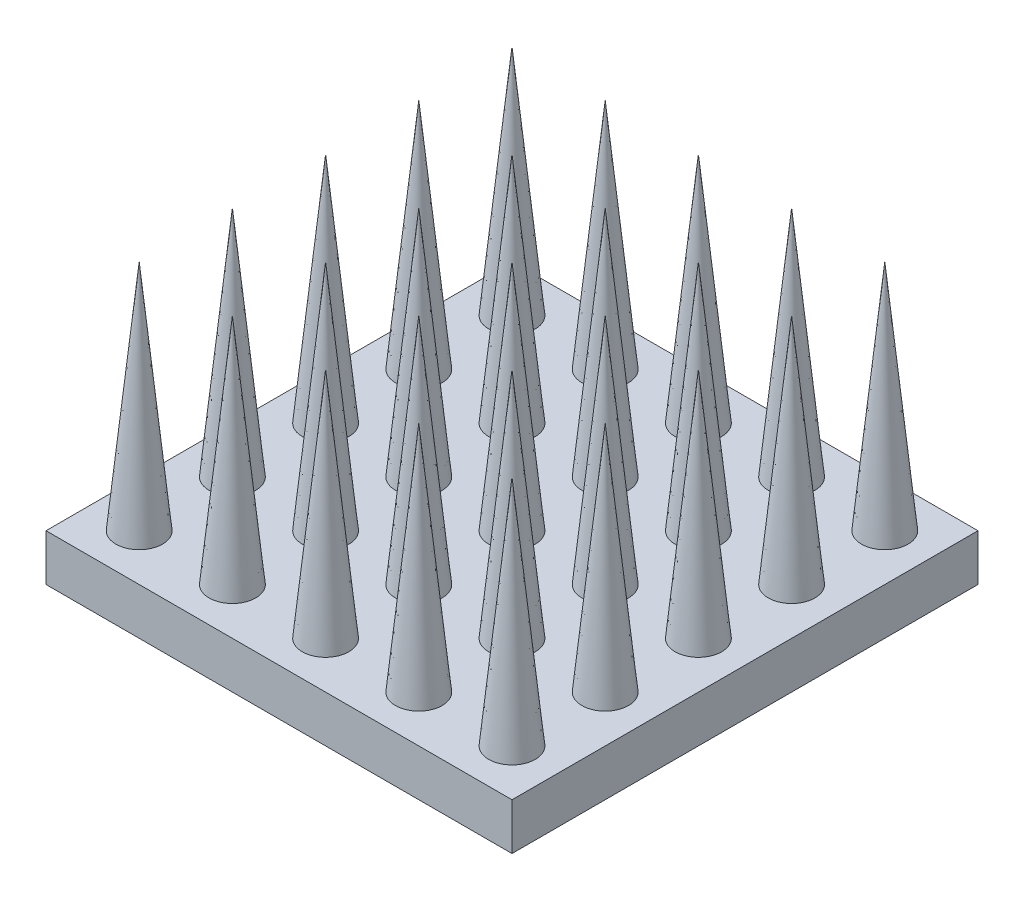
ISO-10303-21;
HEADER;
FILE_DESCRIPTION(('STEP AP214'),'2;1');
FILE_NAME('part.step','',(''),(''),'','','');
FILE_SCHEMA(('AUTOMOTIVE_DESIGN { 1 0 10303 214 1 1 1 1 }'));
ENDSEC;
DATA;
#1=APPLICATION_CONTEXT('core data for automotive mechanical design processes');
#2=APPLICATION_PROTOCOL_DEFINITION('international standard','automotive_design',2000,#1);
#3=PRODUCT_CONTEXT('',#1,'mechanical');
#4=PRODUCT('Part','Part','',(#3));
#5=PRODUCT_RELATED_PRODUCT_CATEGORY('part','',(#4));
#6=PRODUCT_DEFINITION_FORMATION('','',#4);
#7=PRODUCT_DEFINITION_CONTEXT('part definition',#1,'design');
#8=PRODUCT_DEFINITION('design','',#6,#7);
#9=PRODUCT_DEFINITION_SHAPE('','',#8);
#10=(LENGTH_UNIT() NAMED_UNIT(*) SI_UNIT(.MILLI.,.METRE.));
#11=(NAMED_UNIT(*) PLANE_ANGLE_UNIT() SI_UNIT($,.RADIAN.));
#12=(NAMED_UNIT(*) SI_UNIT($,.STERADIAN.) SOLID_ANGLE_UNIT());
#13=UNCERTAINTY_MEASURE_WITH_UNIT(LENGTH_MEASURE(1.E-05),#10,'distance_accuracy_value','');
#14=(GEOMETRIC_REPRESENTATION_CONTEXT(3) GLOBAL_UNCERTAINTY_ASSIGNED_CONTEXT((#13)) GLOBAL_UNIT_ASSIGNED_CONTEXT((#10,
#11,#12)) REPRESENTATION_CONTEXT('',''));
#15=CARTESIAN_POINT('',(0.,0.,0.));
#16=DIRECTION('',(0.,0.,1.));
#17=DIRECTION('',(1.,0.,0.));
#18=AXIS2_PLACEMENT_3D('',#15,#16,#17);
#19=CARTESIAN_POINT('',(-4.5,1.,-4.));
#20=DIRECTION('',(0.,-1.,0.));
#21=DIRECTION('',(1.,0.,0.));
#22=AXIS2_PLACEMENT_3D('',#19,#20,#21);
#23=PLANE('',#22);
#24=CARTESIAN_POINT('',(-4.,1.,-4.));
#25=DIRECTION('',(0.,-1.,0.));
#26=DIRECTION('',(1.,0.,0.));
#27=AXIS2_PLACEMENT_3D('',#24,#25,#26);
#28=CIRCLE('',#27,0.500000000000001);
#29=CARTESIAN_POINT('',(-3.5,1.,-4.));
#30=VERTEX_POINT('',#29);
#31=EDGE_CURVE('E12',#30,#30,#28,.T.);
#32=ORIENTED_EDGE('',*,*,#31,.T.);
#33=EDGE_LOOP('',(#32));
#34=FACE_BOUND('',#33,.T.);
#35=ADVANCED_FACE('F44',(#34),#23,.T.);
#36=CARTESIAN_POINT('',(-4.,1.,-4.));
#37=DIRECTION('',(0.,-1.,0.));
#38=DIRECTION('',(1.,0.,0.));
#39=AXIS2_PLACEMENT_3D('',#36,#37,#38);
#40=CONICAL_SURFACE('',#39,0.500000000000001,0.0996686524911622);
#41=CARTESIAN_POINT('',(-4.,6.,-4.));
#42=VERTEX_POINT('',#41);
#43=VERTEX_LOOP('',#42);
#44=FACE_BOUND('',#43,.T.);
#45=ORIENTED_EDGE('',*,*,#31,.F.);
#46=EDGE_LOOP('',(#45));
#47=FACE_BOUND('',#46,.T.);
#48=ADVANCED_FACE('F51',(#44,#47),#40,.T.);
#49=CLOSED_SHELL('',(#35,#48));
#50=MANIFOLD_SOLID_BREP('B2',#49);
#51=CARTESIAN_POINT('',(-2.5,1.,-4.));
#52=DIRECTION('',(0.,-1.,0.));
#53=DIRECTION('',(1.,0.,0.));
#54=AXIS2_PLACEMENT_3D('',#51,#52,#53);
#55=PLANE('',#54);
#56=CARTESIAN_POINT('',(-2.,1.,-4.));
#57=DIRECTION('',(0.,-1.,0.));
#58=DIRECTION('',(1.,0.,0.));
#59=AXIS2_PLACEMENT_3D('',#56,#57,#58);
#60=CIRCLE('',#59,0.500000000000001);
#61=CARTESIAN_POINT('',(-1.5,1.,-4.));
#62=VERTEX_POINT('',#61);
#63=EDGE_CURVE('E42',#62,#62,#60,.T.);
#64=ORIENTED_EDGE('',*,*,#63,.T.);
#65=EDGE_LOOP('',(#64));
#66=FACE_BOUND('',#65,.T.);
#67=ADVANCED_FACE('F82',(#66),#55,.T.);
#68=CARTESIAN_POINT('',(-2.,1.,-4.));
#69=DIRECTION('',(0.,-1.,0.));
#70=DIRECTION('',(1.,0.,0.));
#71=AXIS2_PLACEMENT_3D('',#68,#69,#70);
#72=CONICAL_SURFACE('',#71,0.500000000000001,0.0996686524911622);
#73=CARTESIAN_POINT('',(-2.,6.,-4.));
#74=VERTEX_POINT('',#73);
#75=VERTEX_LOOP('',#74);
#76=FACE_BOUND('',#75,.T.);
#77=ORIENTED_EDGE('',*,*,#63,.F.);
#78=EDGE_LOOP('',(#77));
#79=FACE_BOUND('',#78,.T.);
#80=ADVANCED_FACE('F89',(#76,#79),#72,.T.);
#81=CLOSED_SHELL('',(#67,#80));
#82=MANIFOLD_SOLID_BREP('B6',#81);
#83=CARTESIAN_POINT('',(-0.500000000000002,1.,-4.));
#84=DIRECTION('',(0.,-1.,0.));
#85=DIRECTION('',(1.,0.,0.));
#86=AXIS2_PLACEMENT_3D('',#83,#84,#85);
#87=PLANE('',#86);
#88=CARTESIAN_POINT('',(0.,1.,-4.));
#89=DIRECTION('',(0.,-1.,0.));
#90=DIRECTION('',(1.,0.,0.));
#91=AXIS2_PLACEMENT_3D('',#88,#89,#90);
#92=CIRCLE('',#91,0.500000000000001);
#93=CARTESIAN_POINT('',(0.5,1.,-4.));
#94=VERTEX_POINT('',#93);
#95=EDGE_CURVE('E80',#94,#94,#92,.T.);
#96=ORIENTED_EDGE('',*,*,#95,.T.);
#97=EDGE_LOOP('',(#96));
#98=FACE_BOUND('',#97,.T.);
#99=ADVANCED_FACE('F120',(#98),#87,.T.);
#100=CARTESIAN_POINT('',(0.,1.,-4.));
#101=DIRECTION('',(0.,-1.,0.));
#102=DIRECTION('',(1.,0.,0.));
#103=AXIS2_PLACEMENT_3D('',#100,#101,#102);
#104=CONICAL_SURFACE('',#103,0.500000000000001,0.0996686524911622);
#105=CARTESIAN_POINT('',(0.,6.,-4.));
#106=VERTEX_POINT('',#105);
#107=VERTEX_LOOP('',#106);
#108=FACE_BOUND('',#107,.T.);
#109=ORIENTED_EDGE('',*,*,#95,.F.);
#110=EDGE_LOOP('',(#109));
#111=FACE_BOUND('',#110,.T.);
#112=ADVANCED_FACE('F127',(#108,#111),#104,.T.);
#113=CLOSED_SHELL('',(#99,#112));
#114=MANIFOLD_SOLID_BREP('B36',#113);
#115=CARTESIAN_POINT('',(1.5,1.,-4.));
#116=DIRECTION('',(0.,-1.,0.));
#117=DIRECTION('',(1.,0.,0.));
#118=AXIS2_PLACEMENT_3D('',#115,#116,#117);
#119=PLANE('',#118);
#120=CARTESIAN_POINT('',(2.,1.,-4.));
#121=DIRECTION('',(0.,-1.,0.));
#122=DIRECTION('',(1.,0.,0.));
#123=AXIS2_PLACEMENT_3D('',#120,#121,#122);
#124=CIRCLE('',#123,0.500000000000001);
#125=CARTESIAN_POINT('',(2.5,1.,-4.));
#126=VERTEX_POINT('',#125);
#127=EDGE_CURVE('E118',#126,#126,#124,.T.);
#128=ORIENTED_EDGE('',*,*,#127,.T.);
#129=EDGE_LOOP('',(#128));
#130=FACE_BOUND('',#129,.T.);
#131=ADVANCED_FACE('F158',(#130),#119,.T.);
#132=CARTESIAN_POINT('',(2.,1.,-4.));
#133=DIRECTION('',(0.,-1.,0.));
#134=DIRECTION('',(1.,0.,0.));
#135=AXIS2_PLACEMENT_3D('',#132,#133,#134);
#136=CONICAL_SURFACE('',#135,0.500000000000001,0.0996686524911622);
#137=CARTESIAN_POINT('',(2.,6.,-4.));
#138=VERTEX_POINT('',#137);
#139=VERTEX_LOOP('',#138);
#140=FACE_BOUND('',#139,.T.);
#141=ORIENTED_EDGE('',*,*,#127,.F.);
#142=EDGE_LOOP('',(#141));
#143=FACE_BOUND('',#142,.T.);
#144=ADVANCED_FACE('F165',(#140,#143),#136,.T.);
#145=CLOSED_SHELL('',(#131,#144));
#146=MANIFOLD_SOLID_BREP('B74',#145);
#147=CARTESIAN_POINT('',(-4.5,1.,-2.));
#148=DIRECTION('',(0.,-1.,0.));
#149=DIRECTION('',(1.,0.,0.));
#150=AXIS2_PLACEMENT_3D('',#147,#148,#149);
#151=PLANE('',#150);
#152=CARTESIAN_POINT('',(-4.,1.,-2.));
#153=DIRECTION('',(0.,-1.,0.));
#154=DIRECTION('',(1.,0.,0.));
#155=AXIS2_PLACEMENT_3D('',#152,#153,#154);
#156=CIRCLE('',#155,0.500000000000001);
#157=CARTESIAN_POINT('',(-3.5,1.,-2.));
#158=VERTEX_POINT('',#157);
#159=EDGE_CURVE('E156',#158,#158,#156,.T.);
#160=ORIENTED_EDGE('',*,*,#159,.T.);
#161=EDGE_LOOP('',(#160));
#162=FACE_BOUND('',#161,.T.);
#163=ADVANCED_FACE('F196',(#162),#151,.T.);
#164=CARTESIAN_POINT('',(-4.,1.,-2.));
#165=DIRECTION('',(0.,-1.,0.));
#166=DIRECTION('',(1.,0.,0.));
#167=AXIS2_PLACEMENT_3D('',#164,#165,#166);
#168=CONICAL_SURFACE('',#167,0.500000000000001,0.0996686524911622);
#169=CARTESIAN_POINT('',(-4.,6.,-2.));
#170=VERTEX_POINT('',#169);
#171=VERTEX_LOOP('',#170);
#172=FACE_BOUND('',#171,.T.);
#173=ORIENTED_EDGE('',*,*,#159,.F.);
#174=EDGE_LOOP('',(#173));
#175=FACE_BOUND('',#174,.T.);
#176=ADVANCED_FACE('F203',(#172,#175),#168,.T.);
#177=CLOSED_SHELL('',(#163,#176));
#178=MANIFOLD_SOLID_BREP('B112',#177);
#179=CARTESIAN_POINT('',(-2.5,1.,-2.));
#180=DIRECTION('',(0.,-1.,0.));
#181=DIRECTION('',(1.,0.,0.));
#182=AXIS2_PLACEMENT_3D('',#179,#180,#181);
#183=PLANE('',#182);
#184=CARTESIAN_POINT('',(-2.,1.,-2.));
#185=DIRECTION('',(0.,-1.,0.));
#186=DIRECTION('',(1.,0.,0.));
#187=AXIS2_PLACEMENT_3D('',#184,#185,#186);
#188=CIRCLE('',#187,0.500000000000001);
#189=CARTESIAN_POINT('',(-1.5,1.,-2.));
#190=VERTEX_POINT('',#189);
#191=EDGE_CURVE('E194',#190,#190,#188,.T.);
#192=ORIENTED_EDGE('',*,*,#191,.T.);
#193=EDGE_LOOP('',(#192));
#194=FACE_BOUND('',#193,.T.);
#195=ADVANCED_FACE('F234',(#194),#183,.T.);
#196=CARTESIAN_POINT('',(-2.,1.,-2.));
#197=DIRECTION('',(0.,-1.,0.));
#198=DIRECTION('',(1.,0.,0.));
#199=AXIS2_PLACEMENT_3D('',#196,#197,#198);
#200=CONICAL_SURFACE('',#199,0.500000000000001,0.0996686524911622);
#201=CARTESIAN_POINT('',(-2.,6.,-2.));
#202=VERTEX_POINT('',#201);
#203=VERTEX_LOOP('',#202);
#204=FACE_BOUND('',#203,.T.);
#205=ORIENTED_EDGE('',*,*,#191,.F.);
#206=EDGE_LOOP('',(#205));
#207=FACE_BOUND('',#206,.T.);
#208=ADVANCED_FACE('F241',(#204,#207),#200,.T.);
#209=CLOSED_SHELL('',(#195,#208));
#210=MANIFOLD_SOLID_BREP('B150',#209);
#211=CARTESIAN_POINT('',(-0.500000000000001,1.,-2.));
#212=DIRECTION('',(0.,-1.,0.));
#213=DIRECTION('',(1.,0.,0.));
#214=AXIS2_PLACEMENT_3D('',#211,#212,#213);
#215=PLANE('',#214);
#216=CARTESIAN_POINT('',(0.,1.,-2.));
#217=DIRECTION('',(0.,-1.,0.));
#218=DIRECTION('',(1.,0.,0.));
#219=AXIS2_PLACEMENT_3D('',#216,#217,#218);
#220=CIRCLE('',#219,0.500000000000001);
#221=CARTESIAN_POINT('',(0.5,1.,-2.));
#222=VERTEX_POINT('',#221);
#223=EDGE_CURVE('E232',#222,#222,#220,.T.);
#224=ORIENTED_EDGE('',*,*,#223,.T.);
#225=EDGE_LOOP('',(#224));
#226=FACE_BOUND('',#225,.T.);
#227=ADVANCED_FACE('F272',(#226),#215,.T.);
#228=CARTESIAN_POINT('',(0.,1.,-2.));
#229=DIRECTION('',(0.,-1.,0.));
#230=DIRECTION('',(1.,0.,0.));
#231=AXIS2_PLACEMENT_3D('',#228,#229,#230);
#232=CONICAL_SURFACE('',#231,0.500000000000001,0.0996686524911622);
#233=CARTESIAN_POINT('',(0.,6.,-2.));
#234=VERTEX_POINT('',#233);
#235=VERTEX_LOOP('',#234);
#236=FACE_BOUND('',#235,.T.);
#237=ORIENTED_EDGE('',*,*,#223,.F.);
#238=EDGE_LOOP('',(#237));
#239=FACE_BOUND('',#238,.T.);
#240=ADVANCED_FACE('F279',(#236,#239),#232,.T.);
#241=CLOSED_SHELL('',(#227,#240));
#242=MANIFOLD_SOLID_BREP('B188',#241);
#243=CARTESIAN_POINT('',(1.5,1.,-2.));
#244=DIRECTION('',(0.,-1.,0.));
#245=DIRECTION('',(1.,0.,0.));
#246=AXIS2_PLACEMENT_3D('',#243,#244,#245);
#247=PLANE('',#246);
#248=CARTESIAN_POINT('',(2.,1.,-2.));
#249=DIRECTION('',(0.,-1.,0.));
#250=DIRECTION('',(1.,0.,0.));
#251=AXIS2_PLACEMENT_3D('',#248,#249,#250);
#252=CIRCLE('',#251,0.500000000000001);
#253=CARTESIAN_POINT('',(2.5,1.,-2.));
#254=VERTEX_POINT('',#253);
#255=EDGE_CURVE('E270',#254,#254,#252,.T.);
#256=ORIENTED_EDGE('',*,*,#255,.T.);
#257=EDGE_LOOP('',(#256));
#258=FACE_BOUND('',#257,.T.);
#259=ADVANCED_FACE('F310',(#258),#247,.T.);
#260=CARTESIAN_POINT('',(2.,1.,-2.));
#261=DIRECTION('',(0.,-1.,0.));
#262=DIRECTION('',(1.,0.,0.));
#263=AXIS2_PLACEMENT_3D('',#260,#261,#262);
#264=CONICAL_SURFACE('',#263,0.500000000000001,0.0996686524911622);
#265=CARTESIAN_POINT('',(2.,6.,-2.));
#266=VERTEX_POINT('',#265);
#267=VERTEX_LOOP('',#266);
#268=FACE_BOUND('',#267,.T.);
#269=ORIENTED_EDGE('',*,*,#255,.F.);
#270=EDGE_LOOP('',(#269));
#271=FACE_BOUND('',#270,.T.);
#272=ADVANCED_FACE('F317',(#268,#271),#264,.T.);
#273=CLOSED_SHELL('',(#259,#272));
#274=MANIFOLD_SOLID_BREP('B226',#273);
#275=CARTESIAN_POINT('',(-4.5,1.,0.));
#276=DIRECTION('',(0.,-1.,0.));
#277=DIRECTION('',(1.,0.,0.));
#278=AXIS2_PLACEMENT_3D('',#275,#276,#277);
#279=PLANE('',#278);
#280=CARTESIAN_POINT('',(-4.,1.,0.));
#281=DIRECTION('',(0.,-1.,0.));
#282=DIRECTION('',(1.,0.,0.));
#283=AXIS2_PLACEMENT_3D('',#280,#281,#282);
#284=CIRCLE('',#283,0.500000000000001);
#285=CARTESIAN_POINT('',(-3.5,1.,0.));
#286=VERTEX_POINT('',#285);
#287=EDGE_CURVE('E308',#286,#286,#284,.T.);
#288=ORIENTED_EDGE('',*,*,#287,.T.);
#289=EDGE_LOOP('',(#288));
#290=FACE_BOUND('',#289,.T.);
#291=ADVANCED_FACE('F348',(#290),#279,.T.);
#292=CARTESIAN_POINT('',(-4.,1.,0.));
#293=DIRECTION('',(0.,-1.,0.));
#294=DIRECTION('',(1.,0.,0.));
#295=AXIS2_PLACEMENT_3D('',#292,#293,#294);
#296=CONICAL_SURFACE('',#295,0.500000000000001,0.0996686524911622);
#297=CARTESIAN_POINT('',(-4.,6.,0.));
#298=VERTEX_POINT('',#297);
#299=VERTEX_LOOP('',#298);
#300=FACE_BOUND('',#299,.T.);
#301=ORIENTED_EDGE('',*,*,#287,.F.);
#302=EDGE_LOOP('',(#301));
#303=FACE_BOUND('',#302,.T.);
#304=ADVANCED_FACE('F355',(#300,#303),#296,.T.);
#305=CLOSED_SHELL('',(#291,#304));
#306=MANIFOLD_SOLID_BREP('B264',#305);
#307=CARTESIAN_POINT('',(-2.5,1.,0.));
#308=DIRECTION('',(0.,-1.,0.));
#309=DIRECTION('',(1.,0.,0.));
#310=AXIS2_PLACEMENT_3D('',#307,#308,#309);
#311=PLANE('',#310);
#312=CARTESIAN_POINT('',(-2.,1.,0.));
#313=DIRECTION('',(0.,-1.,0.));
#314=DIRECTION('',(1.,0.,0.));
#315=AXIS2_PLACEMENT_3D('',#312,#313,#314);
#316=CIRCLE('',#315,0.500000000000001);
#317=CARTESIAN_POINT('',(-1.5,1.,0.));
#318=VERTEX_POINT('',#317);
#319=EDGE_CURVE('E346',#318,#318,#316,.T.);
#320=ORIENTED_EDGE('',*,*,#319,.T.);
#321=EDGE_LOOP('',(#320));
#322=FACE_BOUND('',#321,.T.);
#323=ADVANCED_FACE('F386',(#322),#311,.T.);
#324=CARTESIAN_POINT('',(-2.,1.,0.));
#325=DIRECTION('',(0.,-1.,0.));
#326=DIRECTION('',(1.,0.,0.));
#327=AXIS2_PLACEMENT_3D('',#324,#325,#326);
#328=CONICAL_SURFACE('',#327,0.500000000000001,0.0996686524911622);
#329=CARTESIAN_POINT('',(-2.,6.,0.));
#330=VERTEX_POINT('',#329);
#331=VERTEX_LOOP('',#330);
#332=FACE_BOUND('',#331,.T.);
#333=ORIENTED_EDGE('',*,*,#319,.F.);
#334=EDGE_LOOP('',(#333));
#335=FACE_BOUND('',#334,.T.);
#336=ADVANCED_FACE('F393',(#332,#335),#328,.T.);
#337=CLOSED_SHELL('',(#323,#336));
#338=MANIFOLD_SOLID_BREP('B302',#337);
#339=CARTESIAN_POINT('',(-0.500000000000001,1.,0.));
#340=DIRECTION('',(0.,-1.,0.));
#341=DIRECTION('',(1.,0.,0.));
#342=AXIS2_PLACEMENT_3D('',#339,#340,#341);
#343=PLANE('',#342);
#344=CARTESIAN_POINT('',(0.,1.,0.));
#345=DIRECTION('',(0.,-1.,0.));
#346=DIRECTION('',(1.,0.,0.));
#347=AXIS2_PLACEMENT_3D('',#344,#345,#346);
#348=CIRCLE('',#347,0.500000000000001);
#349=CARTESIAN_POINT('',(0.500000000000001,1.,0.));
#350=VERTEX_POINT('',#349);
#351=EDGE_CURVE('E384',#350,#350,#348,.T.);
#352=ORIENTED_EDGE('',*,*,#351,.T.);
#353=EDGE_LOOP('',(#352));
#354=FACE_BOUND('',#353,.T.);
#355=ADVANCED_FACE('F424',(#354),#343,.T.);
#356=CARTESIAN_POINT('',(0.,1.,0.));
#357=DIRECTION('',(0.,-1.,0.));
#358=DIRECTION('',(1.,0.,0.));
#359=AXIS2_PLACEMENT_3D('',#356,#357,#358);
#360=CONICAL_SURFACE('',#359,0.500000000000001,0.0996686524911622);
#361=CARTESIAN_POINT('',(0.,6.,0.));
#362=VERTEX_POINT('',#361);
#363=VERTEX_LOOP('',#362);
#364=FACE_BOUND('',#363,.T.);
#365=ORIENTED_EDGE('',*,*,#351,.F.);
#366=EDGE_LOOP('',(#365));
#367=FACE_BOUND('',#366,.T.);
#368=ADVANCED_FACE('F431',(#364,#367),#360,.T.);
#369=CLOSED_SHELL('',(#355,#368));
#370=MANIFOLD_SOLID_BREP('B340',#369);
#371=CARTESIAN_POINT('',(1.5,1.,0.));
#372=DIRECTION('',(0.,-1.,0.));
#373=DIRECTION('',(1.,0.,0.));
#374=AXIS2_PLACEMENT_3D('',#371,#372,#373);
#375=PLANE('',#374);
#376=CARTESIAN_POINT('',(2.,1.,0.));
#377=DIRECTION('',(0.,-1.,0.));
#378=DIRECTION('',(1.,0.,0.));
#379=AXIS2_PLACEMENT_3D('',#376,#377,#378);
#380=CIRCLE('',#379,0.500000000000001);
#381=CARTESIAN_POINT('',(2.5,1.,0.));
#382=VERTEX_POINT('',#381);
#383=EDGE_CURVE('E422',#382,#382,#380,.T.);
#384=ORIENTED_EDGE('',*,*,#383,.T.);
#385=EDGE_LOOP('',(#384));
#386=FACE_BOUND('',#385,.T.);
#387=ADVANCED_FACE('F462',(#386),#375,.T.);
#388=CARTESIAN_POINT('',(2.,1.,0.));
#389=DIRECTION('',(0.,-1.,0.));
#390=DIRECTION('',(1.,0.,0.));
#391=AXIS2_PLACEMENT_3D('',#388,#389,#390);
#392=CONICAL_SURFACE('',#391,0.500000000000001,0.0996686524911622);
#393=CARTESIAN_POINT('',(2.,6.,0.));
#394=VERTEX_POINT('',#393);
#395=VERTEX_LOOP('',#394);
#396=FACE_BOUND('',#395,.T.);
#397=ORIENTED_EDGE('',*,*,#383,.F.);
#398=EDGE_LOOP('',(#397));
#399=FACE_BOUND('',#398,.T.);
#400=ADVANCED_FACE('F469',(#396,#399),#392,.T.);
#401=CLOSED_SHELL('',(#387,#400));
#402=MANIFOLD_SOLID_BREP('B378',#401);
#403=CARTESIAN_POINT('',(-4.5,1.,2.));
#404=DIRECTION('',(0.,-1.,0.));
#405=DIRECTION('',(1.,0.,0.));
#406=AXIS2_PLACEMENT_3D('',#403,#404,#405);
#407=PLANE('',#406);
#408=CARTESIAN_POINT('',(-4.,1.,2.));
#409=DIRECTION('',(0.,-1.,0.));
#410=DIRECTION('',(1.,0.,0.));
#411=AXIS2_PLACEMENT_3D('',#408,#409,#410);
#412=CIRCLE('',#411,0.500000000000001);
#413=CARTESIAN_POINT('',(-3.5,1.,2.));
#414=VERTEX_POINT('',#413);
#415=EDGE_CURVE('E460',#414,#414,#412,.T.);
#416=ORIENTED_EDGE('',*,*,#415,.T.);
#417=EDGE_LOOP('',(#416));
#418=FACE_BOUND('',#417,.T.);
#419=ADVANCED_FACE('F500',(#418),#407,.T.);
#420=CARTESIAN_POINT('',(-4.,1.,2.));
#421=DIRECTION('',(0.,-1.,0.));
#422=DIRECTION('',(1.,0.,0.));
#423=AXIS2_PLACEMENT_3D('',#420,#421,#422);
#424=CONICAL_SURFACE('',#423,0.500000000000001,0.0996686524911622);
#425=CARTESIAN_POINT('',(-4.,6.,2.));
#426=VERTEX_POINT('',#425);
#427=VERTEX_LOOP('',#426);
#428=FACE_BOUND('',#427,.T.);
#429=ORIENTED_EDGE('',*,*,#415,.F.);
#430=EDGE_LOOP('',(#429));
#431=FACE_BOUND('',#430,.T.);
#432=ADVANCED_FACE('F507',(#428,#431),#424,.T.);
#433=CLOSED_SHELL('',(#419,#432));
#434=MANIFOLD_SOLID_BREP('B416',#433);
#435=CARTESIAN_POINT('',(-2.5,1.,2.));
#436=DIRECTION('',(0.,-1.,0.));
#437=DIRECTION('',(1.,0.,0.));
#438=AXIS2_PLACEMENT_3D('',#435,#436,#437);
#439=PLANE('',#438);
#440=CARTESIAN_POINT('',(-2.,1.,2.));
#441=DIRECTION('',(0.,-1.,0.));
#442=DIRECTION('',(1.,0.,0.));
#443=AXIS2_PLACEMENT_3D('',#440,#441,#442);
#444=CIRCLE('',#443,0.500000000000001);
#445=CARTESIAN_POINT('',(-1.5,1.,2.));
#446=VERTEX_POINT('',#445);
#447=EDGE_CURVE('E498',#446,#446,#444,.T.);
#448=ORIENTED_EDGE('',*,*,#447,.T.);
#449=EDGE_LOOP('',(#448));
#450=FACE_BOUND('',#449,.T.);
#451=ADVANCED_FACE('F538',(#450),#439,.T.);
#452=CARTESIAN_POINT('',(-2.,1.,2.));
#453=DIRECTION('',(0.,-1.,0.));
#454=DIRECTION('',(1.,0.,0.));
#455=AXIS2_PLACEMENT_3D('',#452,#453,#454);
#456=CONICAL_SURFACE('',#455,0.500000000000001,0.0996686524911622);
#457=CARTESIAN_POINT('',(-2.,6.,2.));
#458=VERTEX_POINT('',#457);
#459=VERTEX_LOOP('',#458);
#460=FACE_BOUND('',#459,.T.);
#461=ORIENTED_EDGE('',*,*,#447,.F.);
#462=EDGE_LOOP('',(#461));
#463=FACE_BOUND('',#462,.T.);
#464=ADVANCED_FACE('F545',(#460,#463),#456,.T.);
#465=CLOSED_SHELL('',(#451,#464));
#466=MANIFOLD_SOLID_BREP('B454',#465);
#467=CARTESIAN_POINT('',(-0.500000000000001,1.,2.));
#468=DIRECTION('',(0.,-1.,0.));
#469=DIRECTION('',(1.,0.,0.));
#470=AXIS2_PLACEMENT_3D('',#467,#468,#469);
#471=PLANE('',#470);
#472=CARTESIAN_POINT('',(0.,1.,2.));
#473=DIRECTION('',(0.,-1.,0.));
#474=DIRECTION('',(1.,0.,0.));
#475=AXIS2_PLACEMENT_3D('',#472,#473,#474);
#476=CIRCLE('',#475,0.500000000000001);
#477=CARTESIAN_POINT('',(0.500000000000001,1.,2.));
#478=VERTEX_POINT('',#477);
#479=EDGE_CURVE('E536',#478,#478,#476,.T.);
#480=ORIENTED_EDGE('',*,*,#479,.T.);
#481=EDGE_LOOP('',(#480));
#482=FACE_BOUND('',#481,.T.);
#483=ADVANCED_FACE('F576',(#482),#471,.T.);
#484=CARTESIAN_POINT('',(0.,1.,2.));
#485=DIRECTION('',(0.,-1.,0.));
#486=DIRECTION('',(1.,0.,0.));
#487=AXIS2_PLACEMENT_3D('',#484,#485,#486);
#488=CONICAL_SURFACE('',#487,0.500000000000001,0.0996686524911622);
#489=CARTESIAN_POINT('',(0.,6.,2.));
#490=VERTEX_POINT('',#489);
#491=VERTEX_LOOP('',#490);
#492=FACE_BOUND('',#491,.T.);
#493=ORIENTED_EDGE('',*,*,#479,.F.);
#494=EDGE_LOOP('',(#493));
#495=FACE_BOUND('',#494,.T.);
#496=ADVANCED_FACE('F583',(#492,#495),#488,.T.);
#497=CLOSED_SHELL('',(#483,#496));
#498=MANIFOLD_SOLID_BREP('B492',#497);
#499=CARTESIAN_POINT('',(1.5,1.,2.));
#500=DIRECTION('',(0.,-1.,0.));
#501=DIRECTION('',(1.,0.,0.));
#502=AXIS2_PLACEMENT_3D('',#499,#500,#501);
#503=PLANE('',#502);
#504=CARTESIAN_POINT('',(2.,1.,2.));
#505=DIRECTION('',(0.,-1.,0.));
#506=DIRECTION('',(1.,0.,0.));
#507=AXIS2_PLACEMENT_3D('',#504,#505,#506);
#508=CIRCLE('',#507,0.500000000000001);
#509=CARTESIAN_POINT('',(2.5,1.,2.));
#510=VERTEX_POINT('',#509);
#511=EDGE_CURVE('E574',#510,#510,#508,.T.);
#512=ORIENTED_EDGE('',*,*,#511,.T.);
#513=EDGE_LOOP('',(#512));
#514=FACE_BOUND('',#513,.T.);
#515=ADVANCED_FACE('F614',(#514),#503,.T.);
#516=CARTESIAN_POINT('',(2.,1.,2.));
#517=DIRECTION('',(0.,-1.,0.));
#518=DIRECTION('',(1.,0.,0.));
#519=AXIS2_PLACEMENT_3D('',#516,#517,#518);
#520=CONICAL_SURFACE('',#519,0.500000000000001,0.0996686524911622);
#521=CARTESIAN_POINT('',(2.,6.,2.));
#522=VERTEX_POINT('',#521);
#523=VERTEX_LOOP('',#522);
#524=FACE_BOUND('',#523,.T.);
#525=ORIENTED_EDGE('',*,*,#511,.F.);
#526=EDGE_LOOP('',(#525));
#527=FACE_BOUND('',#526,.T.);
#528=ADVANCED_FACE('F621',(#524,#527),#520,.T.);
#529=CLOSED_SHELL('',(#515,#528));
#530=MANIFOLD_SOLID_BREP('B530',#529);
#531=CARTESIAN_POINT('',(-4.5,1.,4.));
#532=DIRECTION('',(0.,-1.,0.));
#533=DIRECTION('',(1.,0.,0.));
#534=AXIS2_PLACEMENT_3D('',#531,#532,#533);
#535=PLANE('',#534);
#536=CARTESIAN_POINT('',(-4.,1.,4.));
#537=DIRECTION('',(0.,-1.,0.));
#538=DIRECTION('',(1.,0.,0.));
#539=AXIS2_PLACEMENT_3D('',#536,#537,#538);
#540=CIRCLE('',#539,0.500000000000001);
#541=CARTESIAN_POINT('',(-3.5,1.,4.));
#542=VERTEX_POINT('',#541);
#543=EDGE_CURVE('E612',#542,#542,#540,.T.);
#544=ORIENTED_EDGE('',*,*,#543,.T.);
#545=EDGE_LOOP('',(#544));
#546=FACE_BOUND('',#545,.T.);
#547=ADVANCED_FACE('F652',(#546),#535,.T.);
#548=CARTESIAN_POINT('',(-4.,1.,4.));
#549=DIRECTION('',(0.,-1.,0.));
#550=DIRECTION('',(1.,0.,0.));
#551=AXIS2_PLACEMENT_3D('',#548,#549,#550);
#552=CONICAL_SURFACE('',#551,0.500000000000001,0.0996686524911622);
#553=CARTESIAN_POINT('',(-4.,6.,4.));
#554=VERTEX_POINT('',#553);
#555=VERTEX_LOOP('',#554);
#556=FACE_BOUND('',#555,.T.);
#557=ORIENTED_EDGE('',*,*,#543,.F.);
#558=EDGE_LOOP('',(#557));
#559=FACE_BOUND('',#558,.T.);
#560=ADVANCED_FACE('F659',(#556,#559),#552,.T.);
#561=CLOSED_SHELL('',(#547,#560));
#562=MANIFOLD_SOLID_BREP('B568',#561);
#563=CARTESIAN_POINT('',(-2.5,1.,4.));
#564=DIRECTION('',(0.,-1.,0.));
#565=DIRECTION('',(1.,0.,0.));
#566=AXIS2_PLACEMENT_3D('',#563,#564,#565);
#567=PLANE('',#566);
#568=CARTESIAN_POINT('',(-2.,1.,4.));
#569=DIRECTION('',(0.,-1.,0.));
#570=DIRECTION('',(1.,0.,0.));
#571=AXIS2_PLACEMENT_3D('',#568,#569,#570);
#572=CIRCLE('',#571,0.500000000000001);
#573=CARTESIAN_POINT('',(-1.5,1.,4.));
#574=VERTEX_POINT('',#573);
#575=EDGE_CURVE('E650',#574,#574,#572,.T.);
#576=ORIENTED_EDGE('',*,*,#575,.T.);
#577=EDGE_LOOP('',(#576));
#578=FACE_BOUND('',#577,.T.);
#579=ADVANCED_FACE('F690',(#578),#567,.T.);
#580=CARTESIAN_POINT('',(-2.,1.,4.));
#581=DIRECTION('',(0.,-1.,0.));
#582=DIRECTION('',(1.,0.,0.));
#583=AXIS2_PLACEMENT_3D('',#580,#581,#582);
#584=CONICAL_SURFACE('',#583,0.500000000000001,0.0996686524911622);
#585=CARTESIAN_POINT('',(-2.,6.,4.));
#586=VERTEX_POINT('',#585);
#587=VERTEX_LOOP('',#586);
#588=FACE_BOUND('',#587,.T.);
#589=ORIENTED_EDGE('',*,*,#575,.F.);
#590=EDGE_LOOP('',(#589));
#591=FACE_BOUND('',#590,.T.);
#592=ADVANCED_FACE('F697',(#588,#591),#584,.T.);
#593=CLOSED_SHELL('',(#579,#592));
#594=MANIFOLD_SOLID_BREP('B606',#593);
#595=CARTESIAN_POINT('',(-0.5,1.,4.));
#596=DIRECTION('',(0.,-1.,0.));
#597=DIRECTION('',(1.,0.,0.));
#598=AXIS2_PLACEMENT_3D('',#595,#596,#597);
#599=PLANE('',#598);
#600=CARTESIAN_POINT('',(0.,1.,4.));
#601=DIRECTION('',(0.,-1.,0.));
#602=DIRECTION('',(1.,0.,0.));
#603=AXIS2_PLACEMENT_3D('',#600,#601,#602);
#604=CIRCLE('',#603,0.500000000000001);
#605=CARTESIAN_POINT('',(0.500000000000002,1.,4.));
#606=VERTEX_POINT('',#605);
#607=EDGE_CURVE('E688',#606,#606,#604,.T.);
#608=ORIENTED_EDGE('',*,*,#607,.T.);
#609=EDGE_LOOP('',(#608));
#610=FACE_BOUND('',#609,.T.);
#611=ADVANCED_FACE('F728',(#610),#599,.T.);
#612=CARTESIAN_POINT('',(0.,1.,4.));
#613=DIRECTION('',(0.,-1.,0.));
#614=DIRECTION('',(1.,0.,0.));
#615=AXIS2_PLACEMENT_3D('',#612,#613,#614);
#616=CONICAL_SURFACE('',#615,0.500000000000001,0.0996686524911622);
#617=CARTESIAN_POINT('',(0.,6.,4.));
#618=VERTEX_POINT('',#617);
#619=VERTEX_LOOP('',#618);
#620=FACE_BOUND('',#619,.T.);
#621=ORIENTED_EDGE('',*,*,#607,.F.);
#622=EDGE_LOOP('',(#621));
#623=FACE_BOUND('',#622,.T.);
#624=ADVANCED_FACE('F735',(#620,#623),#616,.T.);
#625=CLOSED_SHELL('',(#611,#624));
#626=MANIFOLD_SOLID_BREP('B644',#625);
#627=CARTESIAN_POINT('',(1.5,1.,4.));
#628=DIRECTION('',(0.,-1.,0.));
#629=DIRECTION('',(1.,0.,0.));
#630=AXIS2_PLACEMENT_3D('',#627,#628,#629);
#631=PLANE('',#630);
#632=CARTESIAN_POINT('',(2.,1.,4.));
#633=DIRECTION('',(0.,-1.,0.));
#634=DIRECTION('',(1.,0.,0.));
#635=AXIS2_PLACEMENT_3D('',#632,#633,#634);
#636=CIRCLE('',#635,0.500000000000001);
#637=CARTESIAN_POINT('',(2.5,1.,4.));
#638=VERTEX_POINT('',#637);
#639=EDGE_CURVE('E726',#638,#638,#636,.T.);
#640=ORIENTED_EDGE('',*,*,#639,.T.);
#641=EDGE_LOOP('',(#640));
#642=FACE_BOUND('',#641,.T.);
#643=ADVANCED_FACE('F766',(#642),#631,.T.);
#644=CARTESIAN_POINT('',(2.,1.,4.));
#645=DIRECTION('',(0.,-1.,0.));
#646=DIRECTION('',(1.,0.,0.));
#647=AXIS2_PLACEMENT_3D('',#644,#645,#646);
#648=CONICAL_SURFACE('',#647,0.500000000000001,0.0996686524911622);
#649=CARTESIAN_POINT('',(2.,6.,4.));
#650=VERTEX_POINT('',#649);
#651=VERTEX_LOOP('',#650);
#652=FACE_BOUND('',#651,.T.);
#653=ORIENTED_EDGE('',*,*,#639,.F.);
#654=EDGE_LOOP('',(#653));
#655=FACE_BOUND('',#654,.T.);
#656=ADVANCED_FACE('F773',(#652,#655),#648,.T.);
#657=CLOSED_SHELL('',(#643,#656));
#658=MANIFOLD_SOLID_BREP('B682',#657);
#659=CARTESIAN_POINT('',(3.5,1.,4.));
#660=DIRECTION('',(0.,-1.,0.));
#661=DIRECTION('',(1.,0.,0.));
#662=AXIS2_PLACEMENT_3D('',#659,#660,#661);
#663=PLANE('',#662);
#664=CARTESIAN_POINT('',(4.,1.,4.));
#665=DIRECTION('',(0.,-1.,0.));
#666=DIRECTION('',(1.,0.,0.));
#667=AXIS2_PLACEMENT_3D('',#664,#665,#666);
#668=CIRCLE('',#667,0.500000000000001);
#669=CARTESIAN_POINT('',(4.5,1.,4.));
#670=VERTEX_POINT('',#669);
#671=EDGE_CURVE('E764',#670,#670,#668,.T.);
#672=ORIENTED_EDGE('',*,*,#671,.T.);
#673=EDGE_LOOP('',(#672));
#674=FACE_BOUND('',#673,.T.);
#675=ADVANCED_FACE('F804',(#674),#663,.T.);
#676=CARTESIAN_POINT('',(4.,1.,4.));
#677=DIRECTION('',(0.,-1.,0.));
#678=DIRECTION('',(1.,0.,0.));
#679=AXIS2_PLACEMENT_3D('',#676,#677,#678);
#680=CONICAL_SURFACE('',#679,0.500000000000001,0.0996686524911622);
#681=CARTESIAN_POINT('',(4.,6.,4.));
#682=VERTEX_POINT('',#681);
#683=VERTEX_LOOP('',#682);
#684=FACE_BOUND('',#683,.T.);
#685=ORIENTED_EDGE('',*,*,#671,.F.);
#686=EDGE_LOOP('',(#685));
#687=FACE_BOUND('',#686,.T.);
#688=ADVANCED_FACE('F811',(#684,#687),#680,.T.);
#689=CLOSED_SHELL('',(#675,#688));
#690=MANIFOLD_SOLID_BREP('B720',#689);
#691=CARTESIAN_POINT('',(3.5,1.,2.));
#692=DIRECTION('',(0.,-1.,0.));
#693=DIRECTION('',(1.,0.,0.));
#694=AXIS2_PLACEMENT_3D('',#691,#692,#693);
#695=PLANE('',#694);
#696=CARTESIAN_POINT('',(4.,1.,2.));
#697=DIRECTION('',(0.,-1.,0.));
#698=DIRECTION('',(1.,0.,0.));
#699=AXIS2_PLACEMENT_3D('',#696,#697,#698);
#700=CIRCLE('',#699,0.500000000000001);
#701=CARTESIAN_POINT('',(4.5,1.,2.));
#702=VERTEX_POINT('',#701);
#703=EDGE_CURVE('E802',#702,#702,#700,.T.);
#704=ORIENTED_EDGE('',*,*,#703,.T.);
#705=EDGE_LOOP('',(#704));
#706=FACE_BOUND('',#705,.T.);
#707=ADVANCED_FACE('F842',(#706),#695,.T.);
#708=CARTESIAN_POINT('',(4.,1.,2.));
#709=DIRECTION('',(0.,-1.,0.));
#710=DIRECTION('',(1.,0.,0.));
#711=AXIS2_PLACEMENT_3D('',#708,#709,#710);
#712=CONICAL_SURFACE('',#711,0.500000000000001,0.0996686524911622);
#713=CARTESIAN_POINT('',(4.,6.,2.));
#714=VERTEX_POINT('',#713);
#715=VERTEX_LOOP('',#714);
#716=FACE_BOUND('',#715,.T.);
#717=ORIENTED_EDGE('',*,*,#703,.F.);
#718=EDGE_LOOP('',(#717));
#719=FACE_BOUND('',#718,.T.);
#720=ADVANCED_FACE('F849',(#716,#719),#712,.T.);
#721=CLOSED_SHELL('',(#707,#720));
#722=MANIFOLD_SOLID_BREP('B758',#721);
#723=CARTESIAN_POINT('',(3.5,1.,0.));
#724=DIRECTION('',(0.,-1.,0.));
#725=DIRECTION('',(1.,0.,0.));
#726=AXIS2_PLACEMENT_3D('',#723,#724,#725);
#727=PLANE('',#726);
#728=CARTESIAN_POINT('',(4.,1.,0.));
#729=DIRECTION('',(0.,-1.,0.));
#730=DIRECTION('',(1.,0.,0.));
#731=AXIS2_PLACEMENT_3D('',#728,#729,#730);
#732=CIRCLE('',#731,0.500000000000001);
#733=CARTESIAN_POINT('',(4.5,1.,0.));
#734=VERTEX_POINT('',#733);
#735=EDGE_CURVE('E840',#734,#734,#732,.T.);
#736=ORIENTED_EDGE('',*,*,#735,.T.);
#737=EDGE_LOOP('',(#736));
#738=FACE_BOUND('',#737,.T.);
#739=ADVANCED_FACE('F880',(#738),#727,.T.);
#740=CARTESIAN_POINT('',(4.,1.,0.));
#741=DIRECTION('',(0.,-1.,0.));
#742=DIRECTION('',(1.,0.,0.));
#743=AXIS2_PLACEMENT_3D('',#740,#741,#742);
#744=CONICAL_SURFACE('',#743,0.500000000000001,0.0996686524911622);
#745=CARTESIAN_POINT('',(4.,6.,0.));
#746=VERTEX_POINT('',#745);
#747=VERTEX_LOOP('',#746);
#748=FACE_BOUND('',#747,.T.);
#749=ORIENTED_EDGE('',*,*,#735,.F.);
#750=EDGE_LOOP('',(#749));
#751=FACE_BOUND('',#750,.T.);
#752=ADVANCED_FACE('F887',(#748,#751),#744,.T.);
#753=CLOSED_SHELL('',(#739,#752));
#754=MANIFOLD_SOLID_BREP('B796',#753);
#755=CARTESIAN_POINT('',(3.5,1.,-2.));
#756=DIRECTION('',(0.,-1.,0.));
#757=DIRECTION('',(1.,0.,0.));
#758=AXIS2_PLACEMENT_3D('',#755,#756,#757);
#759=PLANE('',#758);
#760=CARTESIAN_POINT('',(4.,1.,-2.));
#761=DIRECTION('',(0.,-1.,0.));
#762=DIRECTION('',(1.,0.,0.));
#763=AXIS2_PLACEMENT_3D('',#760,#761,#762);
#764=CIRCLE('',#763,0.500000000000001);
#765=CARTESIAN_POINT('',(4.5,1.,-2.));
#766=VERTEX_POINT('',#765);
#767=EDGE_CURVE('E878',#766,#766,#764,.T.);
#768=ORIENTED_EDGE('',*,*,#767,.T.);
#769=EDGE_LOOP('',(#768));
#770=FACE_BOUND('',#769,.T.);
#771=ADVANCED_FACE('F918',(#770),#759,.T.);
#772=CARTESIAN_POINT('',(4.,1.,-2.));
#773=DIRECTION('',(0.,-1.,0.));
#774=DIRECTION('',(1.,0.,0.));
#775=AXIS2_PLACEMENT_3D('',#772,#773,#774);
#776=CONICAL_SURFACE('',#775,0.500000000000001,0.0996686524911622);
#777=CARTESIAN_POINT('',(4.,6.,-2.));
#778=VERTEX_POINT('',#777);
#779=VERTEX_LOOP('',#778);
#780=FACE_BOUND('',#779,.T.);
#781=ORIENTED_EDGE('',*,*,#767,.F.);
#782=EDGE_LOOP('',(#781));
#783=FACE_BOUND('',#782,.T.);
#784=ADVANCED_FACE('F925',(#780,#783),#776,.T.);
#785=CLOSED_SHELL('',(#771,#784));
#786=MANIFOLD_SOLID_BREP('B834',#785);
#787=CARTESIAN_POINT('',(3.5,1.,-4.));
#788=DIRECTION('',(0.,-1.,0.));
#789=DIRECTION('',(1.,0.,0.));
#790=AXIS2_PLACEMENT_3D('',#787,#788,#789);
#791=PLANE('',#790);
#792=CARTESIAN_POINT('',(4.,1.,-4.));
#793=DIRECTION('',(0.,-1.,0.));
#794=DIRECTION('',(1.,0.,0.));
#795=AXIS2_PLACEMENT_3D('',#792,#793,#794);
#796=CIRCLE('',#795,0.500000000000001);
#797=CARTESIAN_POINT('',(4.5,1.,-4.));
#798=VERTEX_POINT('',#797);
#799=EDGE_CURVE('E916',#798,#798,#796,.T.);
#800=ORIENTED_EDGE('',*,*,#799,.T.);
#801=EDGE_LOOP('',(#800));
#802=FACE_BOUND('',#801,.T.);
#803=ADVANCED_FACE('F955',(#802),#791,.T.);
#804=CARTESIAN_POINT('',(4.,1.,-4.));
#805=DIRECTION('',(0.,-1.,0.));
#806=DIRECTION('',(1.,0.,0.));
#807=AXIS2_PLACEMENT_3D('',#804,#805,#806);
#808=CONICAL_SURFACE('',#807,0.500000000000001,0.0996686524911622);
#809=CARTESIAN_POINT('',(4.,6.,-4.));
#810=VERTEX_POINT('',#809);
#811=VERTEX_LOOP('',#810);
#812=FACE_BOUND('',#811,.T.);
#813=ORIENTED_EDGE('',*,*,#799,.F.);
#814=EDGE_LOOP('',(#813));
#815=FACE_BOUND('',#814,.T.);
#816=ADVANCED_FACE('F962',(#812,#815),#808,.T.);
#817=CLOSED_SHELL('',(#803,#816));
#818=MANIFOLD_SOLID_BREP('B872',#817);
#819=CARTESIAN_POINT('',(-5.,1.,-5.));
#820=DIRECTION('',(1.,0.,0.));
#821=DIRECTION('',(0.,0.,-1.));
#822=AXIS2_PLACEMENT_3D('',#819,#820,#821);
#823=PLANE('',#822);
#824=DIRECTION('',(0.,0.,1.));
#825=VECTOR('',#824,1.);
#826=CARTESIAN_POINT('',(-5.,0.,-5.));
#827=LINE('',#826,#825);
#828=CARTESIAN_POINT('',(-5.,0.,-5.));
#829=VERTEX_POINT('',#828);
#830=CARTESIAN_POINT('',(-5.,0.,5.));
#831=VERTEX_POINT('',#830);
#832=EDGE_CURVE('E1046',#829,#831,#827,.T.);
#833=ORIENTED_EDGE('',*,*,#832,.T.);
#834=DIRECTION('',(0.,-1.,0.));
#835=VECTOR('',#834,1.);
#836=CARTESIAN_POINT('',(-5.,1.,5.));
#837=LINE('',#836,#835);
#838=CARTESIAN_POINT('',(-5.,1.,5.));
#839=VERTEX_POINT('',#838);
#840=EDGE_CURVE('E953',#839,#831,#837,.T.);
#841=ORIENTED_EDGE('',*,*,#840,.F.);
#842=DIRECTION('',(0.,0.,1.));
#843=VECTOR('',#842,1.);
#844=CARTESIAN_POINT('',(-5.,1.,-5.));
#845=LINE('',#844,#843);
#846=CARTESIAN_POINT('',(-5.,1.,-5.));
#847=VERTEX_POINT('',#846);
#848=EDGE_CURVE('E1032',#847,#839,#845,.T.);
#849=ORIENTED_EDGE('',*,*,#848,.F.);
#850=DIRECTION('',(0.,-1.,0.));
#851=VECTOR('',#850,1.);
#852=CARTESIAN_POINT('',(-5.,1.,-5.));
#853=LINE('',#852,#851);
#854=EDGE_CURVE('E999',#847,#829,#853,.T.);
#855=ORIENTED_EDGE('',*,*,#854,.T.);
#856=EDGE_LOOP('',(#833,#841,#849,#855));
#857=FACE_BOUND('',#856,.T.);
#858=ADVANCED_FACE('F983',(#857),#823,.F.);
#859=CARTESIAN_POINT('',(-5.,1.,5.));
#860=DIRECTION('',(0.,0.,-1.));
#861=DIRECTION('',(-1.,0.,0.));
#862=AXIS2_PLACEMENT_3D('',#859,#860,#861);
#863=PLANE('',#862);
#864=DIRECTION('',(1.,0.,0.));
#865=VECTOR('',#864,1.);
#866=CARTESIAN_POINT('',(-5.,0.,5.));
#867=LINE('',#866,#865);
#868=CARTESIAN_POINT('',(5.,0.,5.));
#869=VERTEX_POINT('',#868);
#870=EDGE_CURVE('E1037',#831,#869,#867,.T.);
#871=ORIENTED_EDGE('',*,*,#870,.T.);
#872=DIRECTION('',(0.,-1.,0.));
#873=VECTOR('',#872,1.);
#874=CARTESIAN_POINT('',(5.,1.,5.));
#875=LINE('',#874,#873);
#876=CARTESIAN_POINT('',(5.,1.,5.));
#877=VERTEX_POINT('',#876);
#878=EDGE_CURVE('E991',#877,#869,#875,.T.);
#879=ORIENTED_EDGE('',*,*,#878,.F.);
#880=DIRECTION('',(1.,0.,0.));
#881=VECTOR('',#880,1.);
#882=CARTESIAN_POINT('',(-5.,1.,5.));
#883=LINE('',#882,#881);
#884=EDGE_CURVE('E1024',#839,#877,#883,.T.);
#885=ORIENTED_EDGE('',*,*,#884,.F.);
#886=ORIENTED_EDGE('',*,*,#840,.T.);
#887=EDGE_LOOP('',(#871,#879,#885,#886));
#888=FACE_BOUND('',#887,.T.);
#889=ADVANCED_FACE('F1036',(#888),#863,.F.);
#890=CARTESIAN_POINT('',(5.,1.,-5.));
#891=DIRECTION('',(1.,0.,0.));
#892=DIRECTION('',(0.,0.,-1.));
#893=AXIS2_PLACEMENT_3D('',#890,#891,#892);
#894=PLANE('',#893);
#895=DIRECTION('',(0.,0.,1.));
#896=VECTOR('',#895,1.);
#897=CARTESIAN_POINT('',(5.,0.,-5.));
#898=LINE('',#897,#896);
#899=CARTESIAN_POINT('',(5.,0.,-5.));
#900=VERTEX_POINT('',#899);
#901=EDGE_CURVE('E1049',#900,#869,#898,.T.);
#902=ORIENTED_EDGE('',*,*,#901,.F.);
#903=DIRECTION('',(0.,-1.,0.));
#904=VECTOR('',#903,1.);
#905=CARTESIAN_POINT('',(5.,1.,-5.));
#906=LINE('',#905,#904);
#907=CARTESIAN_POINT('',(5.,1.,-5.));
#908=VERTEX_POINT('',#907);
#909=EDGE_CURVE('E1013',#908,#900,#906,.T.);
#910=ORIENTED_EDGE('',*,*,#909,.F.);
#911=DIRECTION('',(0.,0.,1.));
#912=VECTOR('',#911,1.);
#913=CARTESIAN_POINT('',(5.,1.,-5.));
#914=LINE('',#913,#912);
#915=EDGE_CURVE('E1031',#908,#877,#914,.T.);
#916=ORIENTED_EDGE('',*,*,#915,.T.);
#917=ORIENTED_EDGE('',*,*,#878,.T.);
#918=EDGE_LOOP('',(#902,#910,#916,#917));
#919=FACE_BOUND('',#918,.T.);
#920=ADVANCED_FACE('F1040',(#919),#894,.T.);
#921=CARTESIAN_POINT('',(-5.,1.,-5.));
#922=DIRECTION('',(0.,0.,-1.));
#923=DIRECTION('',(-1.,0.,0.));
#924=AXIS2_PLACEMENT_3D('',#921,#922,#923);
#925=PLANE('',#924);
#926=DIRECTION('',(1.,0.,0.));
#927=VECTOR('',#926,1.);
#928=CARTESIAN_POINT('',(-5.,0.,-5.));
#929=LINE('',#928,#927);
#930=EDGE_CURVE('E1051',#829,#900,#929,.T.);
#931=ORIENTED_EDGE('',*,*,#930,.F.);
#932=ORIENTED_EDGE('',*,*,#854,.F.);
#933=DIRECTION('',(1.,0.,0.));
#934=VECTOR('',#933,1.);
#935=CARTESIAN_POINT('',(-5.,1.,-5.));
#936=LINE('',#935,#934);
#937=EDGE_CURVE('E1041',#847,#908,#936,.T.);
#938=ORIENTED_EDGE('',*,*,#937,.T.);
#939=ORIENTED_EDGE('',*,*,#909,.T.);
#940=EDGE_LOOP('',(#931,#932,#938,#939));
#941=FACE_BOUND('',#940,.T.);
#942=ADVANCED_FACE('F1057',(#941),#925,.T.);
#943=CARTESIAN_POINT('',(0.,1.,0.));
#944=DIRECTION('',(0.,1.,0.));
#945=DIRECTION('',(0.,0.,1.));
#946=AXIS2_PLACEMENT_3D('',#943,#944,#945);
#947=PLANE('',#946);
#948=ORIENTED_EDGE('',*,*,#848,.T.);
#949=ORIENTED_EDGE('',*,*,#884,.T.);
#950=ORIENTED_EDGE('',*,*,#915,.F.);
#951=ORIENTED_EDGE('',*,*,#937,.F.);
#952=EDGE_LOOP('',(#948,#949,#950,#951));
#953=FACE_BOUND('',#952,.T.);
#954=ADVANCED_FACE('F1028',(#953),#947,.T.);
#955=CARTESIAN_POINT('',(0.,0.,0.));
#956=DIRECTION('',(0.,1.,0.));
#957=DIRECTION('',(0.,0.,1.));
#958=AXIS2_PLACEMENT_3D('',#955,#956,#957);
#959=PLANE('',#958);
#960=ORIENTED_EDGE('',*,*,#832,.F.);
#961=ORIENTED_EDGE('',*,*,#930,.T.);
#962=ORIENTED_EDGE('',*,*,#901,.T.);
#963=ORIENTED_EDGE('',*,*,#870,.F.);
#964=EDGE_LOOP('',(#960,#961,#962,#963));
#965=FACE_BOUND('',#964,.T.);
#966=ADVANCED_FACE('F1056',(#965),#959,.F.);
#967=CLOSED_SHELL('',(#858,#889,#920,#942,#954,#966));
#968=MANIFOLD_SOLID_BREP('B910',#967);
#969=ADVANCED_BREP_SHAPE_REPRESENTATION('',(#18,#50,#82,#114,#146,#178,#210,#242,#274,#306,#338,
#370,#402,#434,#466,#498,#530,#562,#594,#626,#658,#690,#722,#754,#786,#818,#968),#14);
#970=SHAPE_DEFINITION_REPRESENTATION(#9,#969);
ENDSEC;
END-ISO-10303-21;
